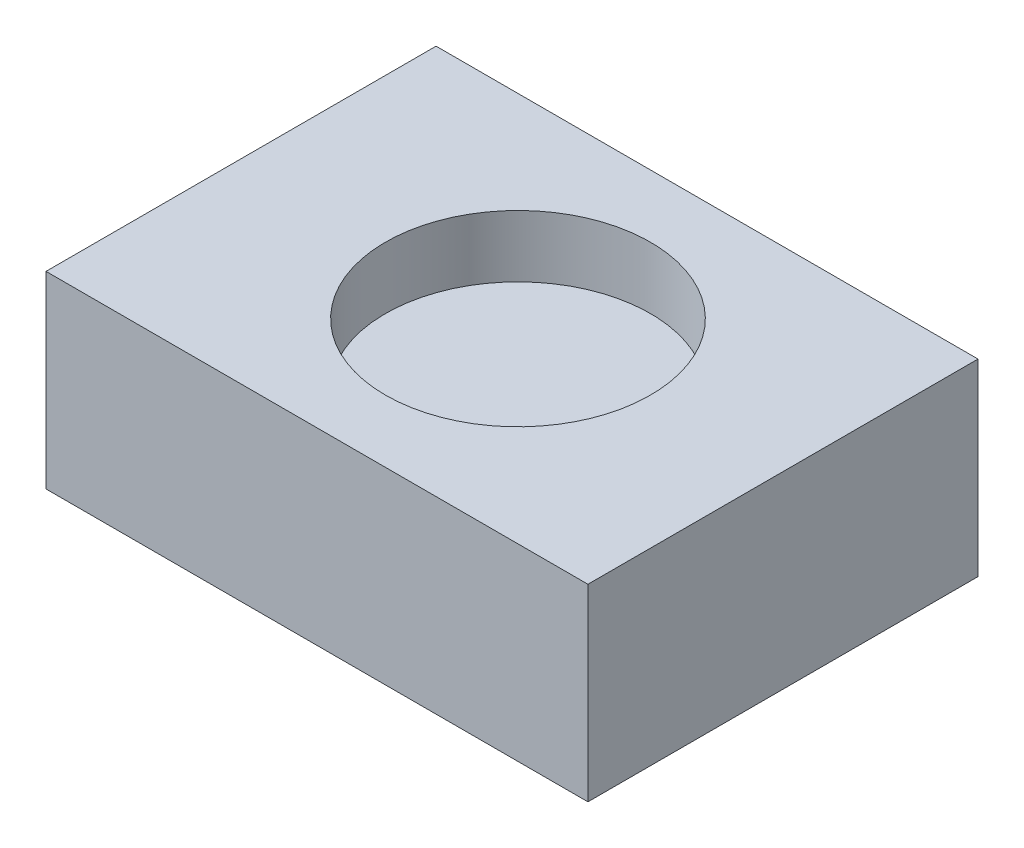
ISO-10303-21;
HEADER;
FILE_DESCRIPTION(('STEP AP214'),'2;1');
FILE_NAME('part.step','',(''),(''),'','','');
FILE_SCHEMA(('AUTOMOTIVE_DESIGN { 1 0 10303 214 1 1 1 1 }'));
ENDSEC;
DATA;
#1=APPLICATION_CONTEXT('core data for automotive mechanical design processes');
#2=APPLICATION_PROTOCOL_DEFINITION('international standard','automotive_design',2000,#1);
#3=PRODUCT_CONTEXT('',#1,'mechanical');
#4=PRODUCT('Part','Part','',(#3));
#5=PRODUCT_RELATED_PRODUCT_CATEGORY('part','',(#4));
#6=PRODUCT_DEFINITION_FORMATION('','',#4);
#7=PRODUCT_DEFINITION_CONTEXT('part definition',#1,'design');
#8=PRODUCT_DEFINITION('design','',#6,#7);
#9=PRODUCT_DEFINITION_SHAPE('','',#8);
#10=(LENGTH_UNIT() NAMED_UNIT(*) SI_UNIT(.MILLI.,.METRE.));
#11=(NAMED_UNIT(*) PLANE_ANGLE_UNIT() SI_UNIT($,.RADIAN.));
#12=(NAMED_UNIT(*) SI_UNIT($,.STERADIAN.) SOLID_ANGLE_UNIT());
#13=UNCERTAINTY_MEASURE_WITH_UNIT(LENGTH_MEASURE(1.E-05),#10,'distance_accuracy_value','');
#14=(GEOMETRIC_REPRESENTATION_CONTEXT(3) GLOBAL_UNCERTAINTY_ASSIGNED_CONTEXT((#13)) GLOBAL_UNIT_ASSIGNED_CONTEXT((#10,
#11,#12)) REPRESENTATION_CONTEXT('',''));
#15=CARTESIAN_POINT('',(0.,0.,0.));
#16=DIRECTION('',(0.,0.,1.));
#17=DIRECTION('',(1.,0.,0.));
#18=AXIS2_PLACEMENT_3D('',#15,#16,#17);
#19=CARTESIAN_POINT('',(0.,0.,0.));
#20=DIRECTION('',(0.,1.,0.));
#21=DIRECTION('',(0.,0.,1.));
#22=AXIS2_PLACEMENT_3D('',#19,#20,#21);
#23=PLANE('',#22);
#24=CARTESIAN_POINT('',(865.,0.,0.));
#25=DIRECTION('',(0.,1.,0.));
#26=DIRECTION('',(0.,0.,1.));
#27=AXIS2_PLACEMENT_3D('',#24,#25,#26);
#28=CIRCLE('',#27,15.);
#29=CARTESIAN_POINT('',(865.,0.,15.));
#30=VERTEX_POINT('',#29);
#31=EDGE_CURVE('E99',#30,#30,#28,.T.);
#32=ORIENTED_EDGE('',*,*,#31,.F.);
#33=EDGE_LOOP('',(#32));
#34=FACE_BOUND('',#33,.T.);
#35=DIRECTION('',(-1.,0.,0.));
#36=VECTOR('',#35,1.);
#37=CARTESIAN_POINT('',(295.,0.,-22.0794863015094));
#38=LINE('',#37,#36);
#39=CARTESIAN_POINT('',(895.,0.,-22.0794863015094));
#40=VERTEX_POINT('',#39);
#41=CARTESIAN_POINT('',(833.650096209078,0.,-22.0794863015094));
#42=VERTEX_POINT('',#41);
#43=EDGE_CURVE('E46',#40,#42,#38,.T.);
#44=ORIENTED_EDGE('',*,*,#43,.T.);
#45=DIRECTION('',(0.,0.,1.));
#46=VECTOR('',#45,1.);
#47=CARTESIAN_POINT('',(833.650096209078,0.,0.));
#48=LINE('',#47,#46);
#49=CARTESIAN_POINT('',(833.650096209078,0.,22.0794863015094));
#50=VERTEX_POINT('',#49);
#51=EDGE_CURVE('E100',#42,#50,#48,.T.);
#52=ORIENTED_EDGE('',*,*,#51,.T.);
#53=DIRECTION('',(1.,0.,0.));
#54=VECTOR('',#53,1.);
#55=CARTESIAN_POINT('',(295.,0.,22.0794863015094));
#56=LINE('',#55,#54);
#57=CARTESIAN_POINT('',(895.,0.,22.0794863015094));
#58=VERTEX_POINT('',#57);
#59=EDGE_CURVE('E11',#50,#58,#56,.T.);
#60=ORIENTED_EDGE('',*,*,#59,.T.);
#61=DIRECTION('',(0.,0.,-1.));
#62=VECTOR('',#61,1.);
#63=CARTESIAN_POINT('',(895.,0.,-22.0794863015094));
#64=LINE('',#63,#62);
#65=EDGE_CURVE('E53',#58,#40,#64,.T.);
#66=ORIENTED_EDGE('',*,*,#65,.T.);
#67=EDGE_LOOP('',(#44,#52,#60,#66));
#68=FACE_BOUND('',#67,.T.);
#69=ADVANCED_FACE('F39',(#34,#68),#23,.T.);
#70=CARTESIAN_POINT('',(125.384435556238,-21.3342589780574,-65.));
#71=DIRECTION('',(0.,-1.,0.));
#72=DIRECTION('',(0.,0.,-1.));
#73=AXIS2_PLACEMENT_3D('',#70,#71,#72);
#74=PLANE('',#73);
#75=DIRECTION('',(-1.,0.,0.));
#76=VECTOR('',#75,1.);
#77=CARTESIAN_POINT('',(125.384435556238,-21.3342589780574,22.0794863015094));
#78=LINE('',#77,#76);
#79=CARTESIAN_POINT('',(895.,-21.3342589780574,22.0794863015094));
#80=VERTEX_POINT('',#79);
#81=CARTESIAN_POINT('',(833.650096209078,-21.3342589780574,22.0794863015094));
#82=VERTEX_POINT('',#81);
#83=EDGE_CURVE('E92',#80,#82,#78,.T.);
#84=ORIENTED_EDGE('',*,*,#83,.T.);
#85=DIRECTION('',(0.,0.,1.));
#86=VECTOR('',#85,1.);
#87=CARTESIAN_POINT('',(833.650096209078,-21.3342589780574,-22.0794863015094));
#88=LINE('',#87,#86);
#89=CARTESIAN_POINT('',(833.650096209078,-21.3342589780574,-22.0794863015094));
#90=VERTEX_POINT('',#89);
#91=EDGE_CURVE('E78',#90,#82,#88,.T.);
#92=ORIENTED_EDGE('',*,*,#91,.F.);
#93=DIRECTION('',(-1.,0.,0.));
#94=VECTOR('',#93,1.);
#95=CARTESIAN_POINT('',(833.650096209078,-21.3342589780574,-22.0794863015094));
#96=LINE('',#95,#94);
#97=CARTESIAN_POINT('',(895.,-21.3342589780574,-22.0794863015094));
#98=VERTEX_POINT('',#97);
#99=EDGE_CURVE('E94',#98,#90,#96,.T.);
#100=ORIENTED_EDGE('',*,*,#99,.F.);
#101=DIRECTION('',(0.,0.,-1.));
#102=VECTOR('',#101,1.);
#103=CARTESIAN_POINT('',(895.,-21.3342589780574,-22.0794863015094));
#104=LINE('',#103,#102);
#105=EDGE_CURVE('E86',#80,#98,#104,.T.);
#106=ORIENTED_EDGE('',*,*,#105,.F.);
#107=EDGE_LOOP('',(#84,#92,#100,#106));
#108=FACE_BOUND('',#107,.T.);
#109=ADVANCED_FACE('F97',(#108),#74,.T.);
#110=CARTESIAN_POINT('',(125.384435556238,-21.3342589780574,22.0794863015094));
#111=DIRECTION('',(0.,0.,-1.));
#112=DIRECTION('',(-1.,0.,0.));
#113=AXIS2_PLACEMENT_3D('',#110,#111,#112);
#114=PLANE('',#113);
#115=DIRECTION('',(0.,1.,0.));
#116=VECTOR('',#115,1.);
#117=CARTESIAN_POINT('',(833.650096209078,-21.3342589780574,22.0794863015094));
#118=LINE('',#117,#116);
#119=EDGE_CURVE('E61',#82,#50,#118,.T.);
#120=ORIENTED_EDGE('',*,*,#119,.F.);
#121=ORIENTED_EDGE('',*,*,#83,.F.);
#122=DIRECTION('',(0.,1.,0.));
#123=VECTOR('',#122,1.);
#124=CARTESIAN_POINT('',(895.,-21.3342589780574,22.0794863015094));
#125=LINE('',#124,#123);
#126=EDGE_CURVE('E93',#80,#58,#125,.T.);
#127=ORIENTED_EDGE('',*,*,#126,.T.);
#128=ORIENTED_EDGE('',*,*,#59,.F.);
#129=EDGE_LOOP('',(#120,#121,#127,#128));
#130=FACE_BOUND('',#129,.T.);
#131=ADVANCED_FACE('F91',(#130),#114,.F.);
#132=CARTESIAN_POINT('',(865.,-7.,0.));
#133=DIRECTION('',(0.,1.,0.));
#134=DIRECTION('',(0.,0.,1.));
#135=AXIS2_PLACEMENT_3D('',#132,#133,#134);
#136=CYLINDRICAL_SURFACE('',#135,15.);
#137=CARTESIAN_POINT('',(865.,-7.,0.));
#138=DIRECTION('',(0.,1.,0.));
#139=DIRECTION('',(0.,0.,1.));
#140=AXIS2_PLACEMENT_3D('',#137,#138,#139);
#141=CIRCLE('',#140,15.);
#142=CARTESIAN_POINT('',(865.,-7.,15.));
#143=VERTEX_POINT('',#142);
#144=EDGE_CURVE('E103',#143,#143,#141,.T.);
#145=ORIENTED_EDGE('',*,*,#144,.F.);
#146=EDGE_LOOP('',(#145));
#147=FACE_BOUND('',#146,.T.);
#148=ORIENTED_EDGE('',*,*,#31,.T.);
#149=EDGE_LOOP('',(#148));
#150=FACE_BOUND('',#149,.T.);
#151=ADVANCED_FACE('F136',(#147,#150),#136,.F.);
#152=CARTESIAN_POINT('',(865.,-7.,0.));
#153=DIRECTION('',(0.,1.,0.));
#154=DIRECTION('',(0.,0.,1.));
#155=AXIS2_PLACEMENT_3D('',#152,#153,#154);
#156=PLANE('',#155);
#157=ORIENTED_EDGE('',*,*,#144,.T.);
#158=EDGE_LOOP('',(#157));
#159=FACE_BOUND('',#158,.T.);
#160=ADVANCED_FACE('F138',(#159),#156,.T.);
#161=CARTESIAN_POINT('',(833.650096209078,-21.3342589780574,-22.0794863015094));
#162=DIRECTION('',(-1.,0.,0.));
#163=DIRECTION('',(0.,0.,1.));
#164=AXIS2_PLACEMENT_3D('',#161,#162,#163);
#165=PLANE('',#164);
#166=DIRECTION('',(0.,1.,0.));
#167=VECTOR('',#166,1.);
#168=CARTESIAN_POINT('',(833.650096209078,-21.3342589780574,-22.0794863015094));
#169=LINE('',#168,#167);
#170=EDGE_CURVE('E81',#90,#42,#169,.T.);
#171=ORIENTED_EDGE('',*,*,#170,.F.);
#172=ORIENTED_EDGE('',*,*,#91,.T.);
#173=ORIENTED_EDGE('',*,*,#119,.T.);
#174=ORIENTED_EDGE('',*,*,#51,.F.);
#175=EDGE_LOOP('',(#171,#172,#173,#174));
#176=FACE_BOUND('',#175,.T.);
#177=ADVANCED_FACE('F79',(#176),#165,.T.);
#178=CARTESIAN_POINT('',(833.650096209078,-21.3342589780574,-22.0794863015094));
#179=DIRECTION('',(0.,0.,-1.));
#180=DIRECTION('',(-1.,0.,0.));
#181=AXIS2_PLACEMENT_3D('',#178,#179,#180);
#182=PLANE('',#181);
#183=DIRECTION('',(0.,1.,0.));
#184=VECTOR('',#183,1.);
#185=CARTESIAN_POINT('',(895.,-21.3342589780574,-22.0794863015094));
#186=LINE('',#185,#184);
#187=EDGE_CURVE('E113',#98,#40,#186,.T.);
#188=ORIENTED_EDGE('',*,*,#187,.F.);
#189=ORIENTED_EDGE('',*,*,#99,.T.);
#190=ORIENTED_EDGE('',*,*,#170,.T.);
#191=ORIENTED_EDGE('',*,*,#43,.F.);
#192=EDGE_LOOP('',(#188,#189,#190,#191));
#193=FACE_BOUND('',#192,.T.);
#194=ADVANCED_FACE('F112',(#193),#182,.T.);
#195=CARTESIAN_POINT('',(895.,-21.3342589780574,-22.0794863015094));
#196=DIRECTION('',(1.,0.,0.));
#197=DIRECTION('',(0.,0.,-1.));
#198=AXIS2_PLACEMENT_3D('',#195,#196,#197);
#199=PLANE('',#198);
#200=ORIENTED_EDGE('',*,*,#126,.F.);
#201=ORIENTED_EDGE('',*,*,#105,.T.);
#202=ORIENTED_EDGE('',*,*,#187,.T.);
#203=ORIENTED_EDGE('',*,*,#65,.F.);
#204=EDGE_LOOP('',(#200,#201,#202,#203));
#205=FACE_BOUND('',#204,.T.);
#206=ADVANCED_FACE('F114',(#205),#199,.T.);
#207=CLOSED_SHELL('',(#69,#109,#131,#151,#160,#177,#194,#206));
#208=MANIFOLD_SOLID_BREP('B2',#207);
#209=ADVANCED_BREP_SHAPE_REPRESENTATION('',(#18,#208),#14);
#210=SHAPE_DEFINITION_REPRESENTATION(#9,#209);
ENDSEC;
END-ISO-10303-21;
